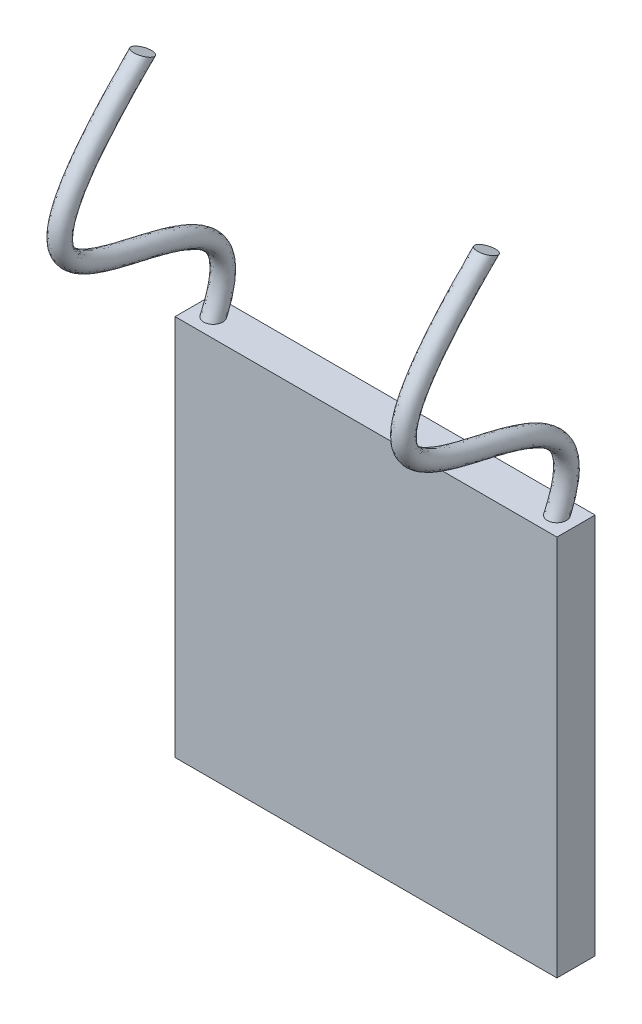
ISO-10303-21;
HEADER;
FILE_DESCRIPTION(('STEP AP214'),'2;1');
FILE_NAME('part.step','',(''),(''),'','','');
FILE_SCHEMA(('AUTOMOTIVE_DESIGN { 1 0 10303 214 1 1 1 1 }'));
ENDSEC;
DATA;
#1=APPLICATION_CONTEXT('core data for automotive mechanical design processes');
#2=APPLICATION_PROTOCOL_DEFINITION('international standard','automotive_design',2000,#1);
#3=PRODUCT_CONTEXT('',#1,'mechanical');
#4=PRODUCT('Part','Part','',(#3));
#5=PRODUCT_RELATED_PRODUCT_CATEGORY('part','',(#4));
#6=PRODUCT_DEFINITION_FORMATION('','',#4);
#7=PRODUCT_DEFINITION_CONTEXT('part definition',#1,'design');
#8=PRODUCT_DEFINITION('design','',#6,#7);
#9=PRODUCT_DEFINITION_SHAPE('','',#8);
#10=(LENGTH_UNIT() NAMED_UNIT(*) SI_UNIT(.MILLI.,.METRE.));
#11=(NAMED_UNIT(*) PLANE_ANGLE_UNIT() SI_UNIT($,.RADIAN.));
#12=(NAMED_UNIT(*) SI_UNIT($,.STERADIAN.) SOLID_ANGLE_UNIT());
#13=UNCERTAINTY_MEASURE_WITH_UNIT(LENGTH_MEASURE(1.E-05),#10,'distance_accuracy_value','');
#14=(GEOMETRIC_REPRESENTATION_CONTEXT(3) GLOBAL_UNCERTAINTY_ASSIGNED_CONTEXT((#13)) GLOBAL_UNIT_ASSIGNED_CONTEXT((#10,
#11,#12)) REPRESENTATION_CONTEXT('',''));
#15=CARTESIAN_POINT('',(0.,0.,0.));
#16=DIRECTION('',(0.,0.,1.));
#17=DIRECTION('',(1.,0.,0.));
#18=AXIS2_PLACEMENT_3D('',#15,#16,#17);
#19=CARTESIAN_POINT('',(-20.,-20.,4.));
#20=DIRECTION('',(1.,0.,0.));
#21=DIRECTION('',(0.,0.,-1.));
#22=AXIS2_PLACEMENT_3D('',#19,#20,#21);
#23=PLANE('',#22);
#24=DIRECTION('',(0.,-1.,0.));
#25=VECTOR('',#24,1.);
#26=CARTESIAN_POINT('',(-20.,-20.,0.));
#27=LINE('',#26,#25);
#28=CARTESIAN_POINT('',(-20.,20.,0.));
#29=VERTEX_POINT('',#28);
#30=CARTESIAN_POINT('',(-20.,-20.,0.));
#31=VERTEX_POINT('',#30);
#32=EDGE_CURVE('E103',#29,#31,#27,.T.);
#33=ORIENTED_EDGE('',*,*,#32,.T.);
#34=DIRECTION('',(0.,0.,-1.));
#35=VECTOR('',#34,1.);
#36=CARTESIAN_POINT('',(-20.,-20.,4.));
#37=LINE('',#36,#35);
#38=CARTESIAN_POINT('',(-20.,-20.,4.));
#39=VERTEX_POINT('',#38);
#40=EDGE_CURVE('E11',#39,#31,#37,.T.);
#41=ORIENTED_EDGE('',*,*,#40,.F.);
#42=DIRECTION('',(0.,-1.,0.));
#43=VECTOR('',#42,1.);
#44=CARTESIAN_POINT('',(-20.,-20.,4.));
#45=LINE('',#44,#43);
#46=CARTESIAN_POINT('',(-20.,20.,4.));
#47=VERTEX_POINT('',#46);
#48=EDGE_CURVE('E104',#47,#39,#45,.T.);
#49=ORIENTED_EDGE('',*,*,#48,.F.);
#50=DIRECTION('',(0.,0.,-1.));
#51=VECTOR('',#50,1.);
#52=CARTESIAN_POINT('',(-20.,20.,4.));
#53=LINE('',#52,#51);
#54=EDGE_CURVE('E110',#47,#29,#53,.T.);
#55=ORIENTED_EDGE('',*,*,#54,.T.);
#56=EDGE_LOOP('',(#33,#41,#49,#55));
#57=FACE_BOUND('',#56,.T.);
#58=ADVANCED_FACE('F35',(#57),#23,.F.);
#59=CARTESIAN_POINT('',(20.,-20.,4.));
#60=DIRECTION('',(0.,1.,0.));
#61=DIRECTION('',(-1.,0.,0.));
#62=AXIS2_PLACEMENT_3D('',#59,#60,#61);
#63=PLANE('',#62);
#64=DIRECTION('',(1.,0.,0.));
#65=VECTOR('',#64,1.);
#66=CARTESIAN_POINT('',(20.,-20.,0.));
#67=LINE('',#66,#65);
#68=CARTESIAN_POINT('',(20.,-20.,0.));
#69=VERTEX_POINT('',#68);
#70=EDGE_CURVE('E113',#31,#69,#67,.T.);
#71=ORIENTED_EDGE('',*,*,#70,.T.);
#72=DIRECTION('',(0.,0.,-1.));
#73=VECTOR('',#72,1.);
#74=CARTESIAN_POINT('',(20.,-20.,4.));
#75=LINE('',#74,#73);
#76=CARTESIAN_POINT('',(20.,-20.,4.));
#77=VERTEX_POINT('',#76);
#78=EDGE_CURVE('E43',#77,#69,#75,.T.);
#79=ORIENTED_EDGE('',*,*,#78,.F.);
#80=DIRECTION('',(1.,0.,0.));
#81=VECTOR('',#80,1.);
#82=CARTESIAN_POINT('',(20.,-20.,4.));
#83=LINE('',#82,#81);
#84=EDGE_CURVE('E82',#39,#77,#83,.T.);
#85=ORIENTED_EDGE('',*,*,#84,.F.);
#86=ORIENTED_EDGE('',*,*,#40,.T.);
#87=EDGE_LOOP('',(#71,#79,#85,#86));
#88=FACE_BOUND('',#87,.T.);
#89=ADVANCED_FACE('F137',(#88),#63,.F.);
#90=CARTESIAN_POINT('',(20.,-20.,4.));
#91=DIRECTION('',(-1.,0.,0.));
#92=DIRECTION('',(0.,0.,1.));
#93=AXIS2_PLACEMENT_3D('',#90,#91,#92);
#94=PLANE('',#93);
#95=DIRECTION('',(0.,1.,0.));
#96=VECTOR('',#95,1.);
#97=CARTESIAN_POINT('',(20.,-20.,0.));
#98=LINE('',#97,#96);
#99=CARTESIAN_POINT('',(20.,20.,0.));
#100=VERTEX_POINT('',#99);
#101=EDGE_CURVE('E69',#69,#100,#98,.T.);
#102=ORIENTED_EDGE('',*,*,#101,.T.);
#103=DIRECTION('',(0.,0.,-1.));
#104=VECTOR('',#103,1.);
#105=CARTESIAN_POINT('',(20.,20.,4.));
#106=LINE('',#105,#104);
#107=CARTESIAN_POINT('',(20.,20.,4.));
#108=VERTEX_POINT('',#107);
#109=EDGE_CURVE('E118',#108,#100,#106,.T.);
#110=ORIENTED_EDGE('',*,*,#109,.F.);
#111=DIRECTION('',(0.,1.,0.));
#112=VECTOR('',#111,1.);
#113=CARTESIAN_POINT('',(20.,-20.,4.));
#114=LINE('',#113,#112);
#115=EDGE_CURVE('E107',#77,#108,#114,.T.);
#116=ORIENTED_EDGE('',*,*,#115,.F.);
#117=ORIENTED_EDGE('',*,*,#78,.T.);
#118=EDGE_LOOP('',(#102,#110,#116,#117));
#119=FACE_BOUND('',#118,.T.);
#120=ADVANCED_FACE('F120',(#119),#94,.F.);
#121=CARTESIAN_POINT('',(20.,20.,4.));
#122=DIRECTION('',(0.,-1.,0.));
#123=DIRECTION('',(1.,0.,0.));
#124=AXIS2_PLACEMENT_3D('',#121,#122,#123);
#125=PLANE('',#124);
#126=CARTESIAN_POINT('',(18.,20.,2.));
#127=DIRECTION('',(0.,1.,0.));
#128=DIRECTION('',(-1.,0.,0.));
#129=AXIS2_PLACEMENT_3D('',#126,#127,#128);
#130=CIRCLE('',#129,1.);
#131=CARTESIAN_POINT('',(17.,20.,2.));
#132=VERTEX_POINT('',#131);
#133=EDGE_CURVE('E94',#132,#132,#130,.T.);
#134=ORIENTED_EDGE('',*,*,#133,.F.);
#135=EDGE_LOOP('',(#134));
#136=FACE_BOUND('',#135,.T.);
#137=CARTESIAN_POINT('',(-18.,20.,2.));
#138=DIRECTION('',(0.,1.,0.));
#139=DIRECTION('',(-1.,0.,0.));
#140=AXIS2_PLACEMENT_3D('',#137,#138,#139);
#141=CIRCLE('',#140,1.);
#142=CARTESIAN_POINT('',(-19.,20.,2.));
#143=VERTEX_POINT('',#142);
#144=EDGE_CURVE('E93',#143,#143,#141,.T.);
#145=ORIENTED_EDGE('',*,*,#144,.F.);
#146=EDGE_LOOP('',(#145));
#147=FACE_BOUND('',#146,.T.);
#148=DIRECTION('',(-1.,0.,0.));
#149=VECTOR('',#148,1.);
#150=CARTESIAN_POINT('',(20.,20.,0.));
#151=LINE('',#150,#149);
#152=EDGE_CURVE('E75',#100,#29,#151,.T.);
#153=ORIENTED_EDGE('',*,*,#152,.T.);
#154=ORIENTED_EDGE('',*,*,#54,.F.);
#155=DIRECTION('',(-1.,0.,0.));
#156=VECTOR('',#155,1.);
#157=CARTESIAN_POINT('',(20.,20.,4.));
#158=LINE('',#157,#156);
#159=EDGE_CURVE('E51',#108,#47,#158,.T.);
#160=ORIENTED_EDGE('',*,*,#159,.F.);
#161=ORIENTED_EDGE('',*,*,#109,.T.);
#162=EDGE_LOOP('',(#153,#154,#160,#161));
#163=FACE_BOUND('',#162,.T.);
#164=ADVANCED_FACE('F127',(#136,#147,#163),#125,.F.);
#165=CARTESIAN_POINT('',(0.,0.,4.));
#166=DIRECTION('',(0.,0.,1.));
#167=DIRECTION('',(1.,0.,0.));
#168=AXIS2_PLACEMENT_3D('',#165,#166,#167);
#169=PLANE('',#168);
#170=ORIENTED_EDGE('',*,*,#48,.T.);
#171=ORIENTED_EDGE('',*,*,#84,.T.);
#172=ORIENTED_EDGE('',*,*,#115,.T.);
#173=ORIENTED_EDGE('',*,*,#159,.T.);
#174=EDGE_LOOP('',(#170,#171,#172,#173));
#175=FACE_BOUND('',#174,.T.);
#176=ADVANCED_FACE('F129',(#175),#169,.T.);
#177=CARTESIAN_POINT('',(0.,0.,0.));
#178=DIRECTION('',(0.,0.,1.));
#179=DIRECTION('',(1.,0.,0.));
#180=AXIS2_PLACEMENT_3D('',#177,#178,#179);
#181=PLANE('',#180);
#182=ORIENTED_EDGE('',*,*,#32,.F.);
#183=ORIENTED_EDGE('',*,*,#152,.F.);
#184=ORIENTED_EDGE('',*,*,#101,.F.);
#185=ORIENTED_EDGE('',*,*,#70,.F.);
#186=EDGE_LOOP('',(#182,#183,#184,#185));
#187=FACE_BOUND('',#186,.T.);
#188=ADVANCED_FACE('F123',(#187),#181,.F.);
#189=CARTESIAN_POINT('',(-18.,47.7315491474002,9.39265668040434));
#190=DIRECTION('',(0.,0.933485479720393,-0.358615196486689));
#191=DIRECTION('',(-1.,0.,0.));
#192=AXIS2_PLACEMENT_3D('',#189,#190,#191);
#193=PLANE('',#192);
#194=CARTESIAN_POINT('',(-18.,47.7315491474002,9.39265668040434));
#195=DIRECTION('',(0.,0.933485479720393,-0.358615196486689));
#196=DIRECTION('',(-1.,0.,0.));
#197=AXIS2_PLACEMENT_3D('',#194,#195,#196);
#198=CIRCLE('',#197,1.);
#199=CARTESIAN_POINT('',(-19.,47.7315491474002,9.39265668040434));
#200=VERTEX_POINT('',#199);
#201=EDGE_CURVE('E97',#200,#200,#198,.T.);
#202=ORIENTED_EDGE('',*,*,#201,.T.);
#203=EDGE_LOOP('',(#202));
#204=FACE_BOUND('',#203,.T.);
#205=ADVANCED_FACE('F167',(#204),#193,.T.);
#206=CARTESIAN_POINT('',(-19.,20.,2.));
#207=CARTESIAN_POINT('',(-19.,21.0670997371017,1.51586374142114));
#208=CARTESIAN_POINT('',(-19.,22.0095176377463,1.22220942508424));
#209=CARTESIAN_POINT('',(-19.,23.6802761002597,0.959390587549751));
#210=CARTESIAN_POINT('',(-19.0000000000023,24.4086166579434,0.990226073083721));
#211=CARTESIAN_POINT('',(-18.9999999999977,25.6865067750286,1.31991273986891));
#212=CARTESIAN_POINT('',(-19.,26.2360563258722,1.61876393486796));
#213=CARTESIAN_POINT('',(-19.,27.1916507655463,2.42800792793888));
#214=CARTESIAN_POINT('',(-19.,27.5976956448252,2.9384007413274));
#215=CARTESIAN_POINT('',(-19.,28.6535027901487,4.70218045341647));
#216=CARTESIAN_POINT('',(-19.,29.1409375383051,6.18816866464113));
#217=CARTESIAN_POINT('',(-19.,29.9652243745418,9.32862246345075));
#218=CARTESIAN_POINT('',(-19.,30.3020764497263,10.983088071588));
#219=CARTESIAN_POINT('',(-19.,31.1074886143521,14.0087039483049));
#220=CARTESIAN_POINT('',(-19.,31.5760486896958,15.379854239414));
#221=CARTESIAN_POINT('',(-19.,32.589387824446,16.8852486259864));
#222=CARTESIAN_POINT('',(-19.,32.9789173648791,17.2951582594693));
#223=CARTESIAN_POINT('',(-19.,33.8967624618766,17.8747264075598));
#224=CARTESIAN_POINT('',(-19.,34.4250780060611,18.0443849419762));
#225=CARTESIAN_POINT('',(-19.,35.6557814438905,18.0869768040178));
#226=CARTESIAN_POINT('',(-18.9999999999985,36.3581693275219,17.9599101476336));
#227=CARTESIAN_POINT('',(-19.0000000000015,37.9723037743115,17.35257754537));
#228=CARTESIAN_POINT('',(-19.0000000000021,38.884050331782,16.8723116085556));
#229=CARTESIAN_POINT('',(-18.9999999999957,41.9862575198189,14.8170037377517));
#230=CARTESIAN_POINT('',(-19.,44.5436856578963,12.6274517563375));
#231=CARTESIAN_POINT('',(-19.,47.7315491474002,9.39265668040434));
#232=CARTESIAN_POINT('',(-19.,20.,4.));
#233=CARTESIAN_POINT('',(-19.,20.9283370369136,3.51586374260125));
#234=CARTESIAN_POINT('',(-19.,21.6945365592223,3.21019307751219));
#235=CARTESIAN_POINT('',(-19.,22.9287373989578,2.82660285222384));
#236=CARTESIAN_POINT('',(-19.0000000000023,23.3927758472019,2.74022926184158));
#237=CARTESIAN_POINT('',(-18.9999999999977,24.1921289199463,2.68419955844024));
#238=CARTESIAN_POINT('',(-19.,24.5442601946982,2.71925065370044));
#239=CARTESIAN_POINT('',(-19.,25.2682200596576,3.03928489506944));
#240=CARTESIAN_POINT('',(-19.,25.6295607961054,3.33160810968787));
#241=CARTESIAN_POINT('',(-19.,26.6283586156752,4.59513649010258));
#242=CARTESIAN_POINT('',(-19.,27.1564779628916,5.9275783373604));
#243=CARTESIAN_POINT('',(-19.,28.0068299642699,8.91548996377307));
#244=CARTESIAN_POINT('',(-19.,28.3435527999129,10.5690223824174));
#245=CARTESIAN_POINT('',(-19.,29.1208371103265,13.7627749363371));
#246=CARTESIAN_POINT('',(-19.,29.5348478776269,15.3017003911743));
#247=CARTESIAN_POINT('',(-19.,30.6514997930974,17.4216646355104));
#248=CARTESIAN_POINT('',(-19.,31.1207158195899,18.1094377853342));
#249=CARTESIAN_POINT('',(-19.,32.4127459371517,19.2580770536007));
#250=CARTESIAN_POINT('',(-19.,33.2427835204446,19.6904420220105));
#251=CARTESIAN_POINT('',(-19.,35.0604372756888,20.024214411342));
#252=CARTESIAN_POINT('',(-18.9999999999985,36.0280301116144,19.9424437799874));
#253=CARTESIAN_POINT('',(-19.0000000000015,38.0384460537261,19.3613226075603));
#254=CARTESIAN_POINT('',(-19.0000000000021,39.0916060563703,18.8646032160699));
#255=CARTESIAN_POINT('',(-18.9999999999957,42.522391115969,16.7565350442141));
#256=CARTESIAN_POINT('',(-19.,45.1829074666191,14.5243911131859));
#257=CARTESIAN_POINT('',(-19.,48.4487795403736,11.2596276398451));
#258=CARTESIAN_POINT('',(-17.,20.,4.));
#259=CARTESIAN_POINT('',(-17.,20.9283370369136,3.51586374260125));
#260=CARTESIAN_POINT('',(-17.,21.6945365592223,3.21019307751219));
#261=CARTESIAN_POINT('',(-17.,22.9287373989578,2.82660285222384));
#262=CARTESIAN_POINT('',(-17.0000000000023,23.3927758472019,2.74022926184158));
#263=CARTESIAN_POINT('',(-16.9999999999977,24.1921289199463,2.68419955844024));
#264=CARTESIAN_POINT('',(-17.,24.5442601946982,2.71925065370044));
#265=CARTESIAN_POINT('',(-17.,25.2682200596576,3.03928489506944));
#266=CARTESIAN_POINT('',(-17.,25.6295607961054,3.33160810968787));
#267=CARTESIAN_POINT('',(-17.,26.6283586156752,4.59513649010258));
#268=CARTESIAN_POINT('',(-17.,27.1564779628916,5.9275783373604));
#269=CARTESIAN_POINT('',(-17.,28.0068299642699,8.91548996377307));
#270=CARTESIAN_POINT('',(-17.,28.3435527999129,10.5690223824174));
#271=CARTESIAN_POINT('',(-17.,29.1208371103265,13.7627749363371));
#272=CARTESIAN_POINT('',(-17.,29.5348478776269,15.3017003911743));
#273=CARTESIAN_POINT('',(-17.,30.6514997930974,17.4216646355104));
#274=CARTESIAN_POINT('',(-17.,31.1207158195899,18.1094377853342));
#275=CARTESIAN_POINT('',(-17.,32.4127459371517,19.2580770536007));
#276=CARTESIAN_POINT('',(-17.,33.2427835204446,19.6904420220105));
#277=CARTESIAN_POINT('',(-17.,35.0604372756888,20.024214411342));
#278=CARTESIAN_POINT('',(-16.9999999999985,36.0280301116144,19.9424437799874));
#279=CARTESIAN_POINT('',(-17.0000000000015,38.0384460537261,19.3613226075603));
#280=CARTESIAN_POINT('',(-17.0000000000021,39.0916060563703,18.8646032160699));
#281=CARTESIAN_POINT('',(-16.9999999999957,42.522391115969,16.7565350442141));
#282=CARTESIAN_POINT('',(-17.,45.1829074666191,14.5243911131859));
#283=CARTESIAN_POINT('',(-17.,48.4487795403736,11.2596276398451));
#284=CARTESIAN_POINT('',(-17.,20.,2.));
#285=CARTESIAN_POINT('',(-17.,21.0670997371017,1.51586374142114));
#286=CARTESIAN_POINT('',(-17.,22.0095176377463,1.22220942508424));
#287=CARTESIAN_POINT('',(-17.,23.6802761002597,0.959390587549751));
#288=CARTESIAN_POINT('',(-17.0000000000023,24.4086166579434,0.990226073083721));
#289=CARTESIAN_POINT('',(-16.9999999999977,25.6865067750286,1.31991273986891));
#290=CARTESIAN_POINT('',(-17.,26.2360563258722,1.61876393486796));
#291=CARTESIAN_POINT('',(-17.,27.1916507655463,2.42800792793888));
#292=CARTESIAN_POINT('',(-17.,27.5976956448252,2.9384007413274));
#293=CARTESIAN_POINT('',(-17.,28.6535027901487,4.70218045341647));
#294=CARTESIAN_POINT('',(-17.,29.1409375383051,6.18816866464113));
#295=CARTESIAN_POINT('',(-17.,29.9652243745418,9.32862246345075));
#296=CARTESIAN_POINT('',(-17.,30.3020764497263,10.983088071588));
#297=CARTESIAN_POINT('',(-17.,31.1074886143521,14.0087039483049));
#298=CARTESIAN_POINT('',(-17.,31.5760486896958,15.379854239414));
#299=CARTESIAN_POINT('',(-17.,32.589387824446,16.8852486259864));
#300=CARTESIAN_POINT('',(-17.,32.9789173648791,17.2951582594693));
#301=CARTESIAN_POINT('',(-17.,33.8967624618766,17.8747264075598));
#302=CARTESIAN_POINT('',(-17.,34.4250780060611,18.0443849419762));
#303=CARTESIAN_POINT('',(-17.,35.6557814438905,18.0869768040178));
#304=CARTESIAN_POINT('',(-16.9999999999985,36.3581693275219,17.9599101476336));
#305=CARTESIAN_POINT('',(-17.0000000000015,37.9723037743115,17.35257754537));
#306=CARTESIAN_POINT('',(-17.0000000000021,38.884050331782,16.8723116085556));
#307=CARTESIAN_POINT('',(-16.9999999999957,41.9862575198189,14.8170037377517));
#308=CARTESIAN_POINT('',(-17.,44.5436856578963,12.6274517563375));
#309=CARTESIAN_POINT('',(-17.,47.7315491474002,9.39265668040434));
#310=CARTESIAN_POINT('',(-17.,20.,0.));
#311=CARTESIAN_POINT('',(-17.,21.2058624372897,-0.484136259758961));
#312=CARTESIAN_POINT('',(-17.,22.3244987162703,-0.765774227343708));
#313=CARTESIAN_POINT('',(-17.,24.4318148015616,-0.907821677124339));
#314=CARTESIAN_POINT('',(-17.0000000000023,25.4244574686849,-0.759777115674136));
#315=CARTESIAN_POINT('',(-16.9999999999977,27.1808846301108,-0.0443740787024094));
#316=CARTESIAN_POINT('',(-17.,27.9278524570462,0.518277216035486));
#317=CARTESIAN_POINT('',(-17.,29.1150814714349,1.81673096080833));
#318=CARTESIAN_POINT('',(-17.,29.5658304935451,2.54519337296693));
#319=CARTESIAN_POINT('',(-17.,30.6786469646223,4.80922441673037));
#320=CARTESIAN_POINT('',(-17.,31.1253971137185,6.44875899192187));
#321=CARTESIAN_POINT('',(-17.,31.9236187848137,9.74175496312843));
#322=CARTESIAN_POINT('',(-17.,32.2606000995397,11.3971537607586));
#323=CARTESIAN_POINT('',(-17.,33.0941401183778,14.2546329602727));
#324=CARTESIAN_POINT('',(-17.,33.6172495017648,15.4580080876536));
#325=CARTESIAN_POINT('',(-17.,34.5272758557946,16.3488326164625));
#326=CARTESIAN_POINT('',(-17.,34.8371189101684,16.4808787336045));
#327=CARTESIAN_POINT('',(-17.,35.3807789866015,16.4913757615189));
#328=CARTESIAN_POINT('',(-17.,35.6073724916777,16.3983278619419));
#329=CARTESIAN_POINT('',(-17.,36.2511256120921,16.1497391966936));
#330=CARTESIAN_POINT('',(-16.9999999999985,36.6883085434295,15.9773765152798));
#331=CARTESIAN_POINT('',(-17.0000000000015,37.9061614948969,15.3438324831796));
#332=CARTESIAN_POINT('',(-17.0000000000021,38.6764946071936,14.8800200010413));
#333=CARTESIAN_POINT('',(-16.9999999999957,41.4501239236687,12.8774724312892));
#334=CARTESIAN_POINT('',(-17.,43.9044638491734,10.7305123994892));
#335=CARTESIAN_POINT('',(-17.,47.0143187544268,7.52568572096355));
#336=CARTESIAN_POINT('',(-19.,20.,0.));
#337=CARTESIAN_POINT('',(-19.,21.2058624372897,-0.484136259758961));
#338=CARTESIAN_POINT('',(-19.,22.3244987162703,-0.765774227343708));
#339=CARTESIAN_POINT('',(-19.,24.4318148015616,-0.907821677124339));
#340=CARTESIAN_POINT('',(-19.0000000000023,25.4244574686849,-0.759777115674136));
#341=CARTESIAN_POINT('',(-18.9999999999977,27.1808846301108,-0.0443740787024093));
#342=CARTESIAN_POINT('',(-19.,27.9278524570462,0.518277216035486));
#343=CARTESIAN_POINT('',(-19.,29.1150814714349,1.81673096080833));
#344=CARTESIAN_POINT('',(-19.,29.5658304935451,2.54519337296693));
#345=CARTESIAN_POINT('',(-19.,30.6786469646223,4.80922441673037));
#346=CARTESIAN_POINT('',(-19.,31.1253971137185,6.44875899192187));
#347=CARTESIAN_POINT('',(-19.,31.9236187848137,9.74175496312843));
#348=CARTESIAN_POINT('',(-19.,32.2606000995397,11.3971537607586));
#349=CARTESIAN_POINT('',(-19.,33.0941401183778,14.2546329602727));
#350=CARTESIAN_POINT('',(-19.,33.6172495017648,15.4580080876536));
#351=CARTESIAN_POINT('',(-19.,34.5272758557946,16.3488326164625));
#352=CARTESIAN_POINT('',(-19.,34.8371189101684,16.4808787336045));
#353=CARTESIAN_POINT('',(-19.,35.3807789866015,16.4913757615189));
#354=CARTESIAN_POINT('',(-19.,35.6073724916777,16.3983278619419));
#355=CARTESIAN_POINT('',(-19.,36.2511256120921,16.1497391966936));
#356=CARTESIAN_POINT('',(-18.9999999999985,36.6883085434295,15.9773765152798));
#357=CARTESIAN_POINT('',(-19.0000000000015,37.9061614948969,15.3438324831796));
#358=CARTESIAN_POINT('',(-19.0000000000021,38.6764946071936,14.8800200010413));
#359=CARTESIAN_POINT('',(-18.9999999999957,41.4501239236687,12.8774724312892));
#360=CARTESIAN_POINT('',(-19.,43.9044638491734,10.7305123994892));
#361=CARTESIAN_POINT('',(-19.,47.0143187544268,7.52568572096355));
#362=CARTESIAN_POINT('',(-19.,20.,2.));
#363=CARTESIAN_POINT('',(-19.,21.0670997371017,1.51586374142114));
#364=CARTESIAN_POINT('',(-19.,22.0095176377463,1.22220942508424));
#365=CARTESIAN_POINT('',(-19.,23.6802761002597,0.959390587549751));
#366=CARTESIAN_POINT('',(-19.0000000000023,24.4086166579434,0.990226073083721));
#367=CARTESIAN_POINT('',(-18.9999999999977,25.6865067750286,1.31991273986891));
#368=CARTESIAN_POINT('',(-19.,26.2360563258722,1.61876393486796));
#369=CARTESIAN_POINT('',(-19.,27.1916507655463,2.42800792793888));
#370=CARTESIAN_POINT('',(-19.,27.5976956448252,2.9384007413274));
#371=CARTESIAN_POINT('',(-19.,28.6535027901487,4.70218045341647));
#372=CARTESIAN_POINT('',(-19.,29.1409375383051,6.18816866464113));
#373=CARTESIAN_POINT('',(-19.,29.9652243745418,9.32862246345075));
#374=CARTESIAN_POINT('',(-19.,30.3020764497263,10.983088071588));
#375=CARTESIAN_POINT('',(-19.,31.1074886143521,14.0087039483049));
#376=CARTESIAN_POINT('',(-19.,31.5760486896958,15.379854239414));
#377=CARTESIAN_POINT('',(-19.,32.589387824446,16.8852486259864));
#378=CARTESIAN_POINT('',(-19.,32.9789173648791,17.2951582594693));
#379=CARTESIAN_POINT('',(-19.,33.8967624618766,17.8747264075598));
#380=CARTESIAN_POINT('',(-19.,34.4250780060611,18.0443849419762));
#381=CARTESIAN_POINT('',(-19.,35.6557814438905,18.0869768040178));
#382=CARTESIAN_POINT('',(-18.9999999999985,36.3581693275219,17.9599101476336));
#383=CARTESIAN_POINT('',(-19.0000000000015,37.9723037743115,17.35257754537));
#384=CARTESIAN_POINT('',(-19.0000000000021,38.884050331782,16.8723116085556));
#385=CARTESIAN_POINT('',(-18.9999999999957,41.9862575198189,14.8170037377517));
#386=CARTESIAN_POINT('',(-19.,44.5436856578963,12.6274517563375));
#387=CARTESIAN_POINT('',(-19.,47.7315491474002,9.39265668040434));
#388=(BOUNDED_SURFACE() B_SPLINE_SURFACE(3,3,((#206,#207,#208,#209,#210,#211,#212,#213,#214,
#215,#216,#217,#218,#219,#220,#221,#222,#223,#224,#225,#226,#227,#228,#229,#230,#231),(#232,
#233,#234,#235,#236,#237,#238,#239,#240,#241,#242,#243,#244,#245,#246,#247,#248,#249,#250,#251,
#252,#253,#254,#255,#256,#257),(#258,#259,#260,#261,#262,#263,#264,#265,#266,#267,#268,#269,
#270,#271,#272,#273,#274,#275,#276,#277,#278,#279,#280,#281,#282,#283),(#284,#285,#286,#287,
#288,#289,#290,#291,#292,#293,#294,#295,#296,#297,#298,#299,#300,#301,#302,#303,#304,#305,#306,
#307,#308,#309),(#310,#311,#312,#313,#314,#315,#316,#317,#318,#319,#320,#321,#322,#323,#324,
#325,#326,#327,#328,#329,#330,#331,#332,#333,#334,#335),(#336,#337,#338,#339,#340,#341,#342,
#343,#344,#345,#346,#347,#348,#349,#350,#351,#352,#353,#354,#355,#356,#357,#358,#359,#360,#361),
(#362,#363,#364,#365,#366,#367,#368,#369,#370,#371,#372,#373,#374,#375,#376,#377,#378,#379,#380,
#381,#382,#383,#384,#385,#386,#387)),.UNSPECIFIED.,.T.,.F.,.F.) B_SPLINE_SURFACE_WITH_KNOTS((4,
3,4),(4,2,2,2,2,2,2,2,2,2,2,2,4),(0.,0.5,1.),(0.,0.0625,0.125,0.1875,0.25,0.375,0.5,0.625,
0.6875,0.75,0.8125,0.875,1.),
.UNSPECIFIED.) GEOMETRIC_REPRESENTATION_ITEM() RATIONAL_B_SPLINE_SURFACE(((1.,1.,1.,1.,1.,1.,1.,
1.,1.,1.,1.,1.,1.,1.,1.,1.,1.,1.,1.,1.,1.,1.,1.,1.,1.,1.),(0.333333333333333,0.333333333333333,
0.333333333333333,0.333333333333333,0.333333333333333,0.333333333333333,0.333333333333333,
0.333333333333333,0.333333333333333,0.333333333333333,0.333333333333333,0.333333333333333,
0.333333333333333,0.333333333333333,0.333333333333333,0.333333333333333,0.333333333333333,
0.333333333333333,0.333333333333333,0.333333333333333,0.333333333333333,0.333333333333333,
0.333333333333333,0.333333333333333,0.333333333333333,0.333333333333333),(0.333333333333333,
0.333333333333333,0.333333333333333,0.333333333333333,0.333333333333333,0.333333333333333,
0.333333333333333,0.333333333333333,0.333333333333333,0.333333333333333,0.333333333333333,
0.333333333333333,0.333333333333333,0.333333333333333,0.333333333333333,0.333333333333333,
0.333333333333333,0.333333333333333,0.333333333333333,0.333333333333333,0.333333333333333,
0.333333333333333,0.333333333333333,0.333333333333333,0.333333333333333,0.333333333333333),(1.,
1.,1.,1.,1.,1.,1.,1.,1.,1.,1.,1.,1.,1.,1.,1.,1.,1.,1.,1.,1.,1.,1.,1.,1.,1.),(0.333333333333333,
0.333333333333333,0.333333333333333,0.333333333333333,0.333333333333333,0.333333333333333,
0.333333333333333,0.333333333333333,0.333333333333333,0.333333333333333,0.333333333333333,
0.333333333333333,0.333333333333333,0.333333333333333,0.333333333333333,0.333333333333333,
0.333333333333333,0.333333333333333,0.333333333333333,0.333333333333333,0.333333333333333,
0.333333333333333,0.333333333333333,0.333333333333333,0.333333333333333,0.333333333333333),
(0.333333333333333,0.333333333333333,0.333333333333333,0.333333333333333,0.333333333333333,
0.333333333333333,0.333333333333333,0.333333333333333,0.333333333333333,0.333333333333333,
0.333333333333333,0.333333333333333,0.333333333333333,0.333333333333333,0.333333333333333,
0.333333333333333,0.333333333333333,0.333333333333333,0.333333333333333,0.333333333333333,
0.333333333333333,0.333333333333333,0.333333333333333,0.333333333333333,0.333333333333333,
0.333333333333333),(1.,1.,1.,1.,1.,1.,1.,1.,1.,1.,1.,1.,1.,1.,1.,1.,1.,1.,1.,1.,1.,1.,1.,1.,1.,1.))) REPRESENTATION_ITEM('') SURFACE());
#389=ORIENTED_EDGE('',*,*,#201,.F.);
#390=EDGE_LOOP('',(#389));
#391=FACE_BOUND('',#390,.T.);
#392=ORIENTED_EDGE('',*,*,#144,.T.);
#393=EDGE_LOOP('',(#392));
#394=FACE_BOUND('',#393,.T.);
#395=ADVANCED_FACE('F168',(#391,#394),#388,.T.);
#396=CARTESIAN_POINT('',(18.,47.7315491474002,9.39265668040434));
#397=DIRECTION('',(0.,0.933485479720393,-0.358615196486689));
#398=DIRECTION('',(-1.,0.,0.));
#399=AXIS2_PLACEMENT_3D('',#396,#397,#398);
#400=PLANE('',#399);
#401=CARTESIAN_POINT('',(18.,47.7315491474002,9.39265668040434));
#402=DIRECTION('',(0.,0.933485479720393,-0.358615196486689));
#403=DIRECTION('',(-1.,0.,0.));
#404=AXIS2_PLACEMENT_3D('',#401,#402,#403);
#405=CIRCLE('',#404,1.);
#406=CARTESIAN_POINT('',(17.,47.7315491474002,9.39265668040434));
#407=VERTEX_POINT('',#406);
#408=EDGE_CURVE('E90',#407,#407,#405,.T.);
#409=ORIENTED_EDGE('',*,*,#408,.T.);
#410=EDGE_LOOP('',(#409));
#411=FACE_BOUND('',#410,.T.);
#412=ADVANCED_FACE('F91',(#411),#400,.T.);
#413=CARTESIAN_POINT('',(17.,20.,2.));
#414=CARTESIAN_POINT('',(17.,21.0670997371017,1.51586374142114));
#415=CARTESIAN_POINT('',(17.,22.0095176377463,1.22220942508497));
#416=CARTESIAN_POINT('',(17.,23.6802761002597,0.959390587549019));
#417=CARTESIAN_POINT('',(16.9999999999977,24.4086166579423,0.990226073083153));
#418=CARTESIAN_POINT('',(17.0000000000023,25.6865067750297,1.31991273986949));
#419=CARTESIAN_POINT('',(17.,26.2360563258733,1.61876393486796));
#420=CARTESIAN_POINT('',(17.,27.1916507655452,2.42800792793889));
#421=CARTESIAN_POINT('',(17.,27.5976956448252,2.93840074132741));
#422=CARTESIAN_POINT('',(17.,28.6535027901487,4.70218045341648));
#423=CARTESIAN_POINT('',(17.,29.1409375383023,6.18816866464114));
#424=CARTESIAN_POINT('',(17.,29.9652243745446,9.32862246345076));
#425=CARTESIAN_POINT('',(17.,30.3020764497263,10.983088071588));
#426=CARTESIAN_POINT('',(17.,31.1074886143521,14.0087039483049));
#427=CARTESIAN_POINT('',(17.,31.5760486897,15.379854239414));
#428=CARTESIAN_POINT('',(17.,32.5893878244439,16.8852486259864));
#429=CARTESIAN_POINT('',(17.,32.9789173648791,17.2951582594693));
#430=CARTESIAN_POINT('',(17.,33.8967624618766,17.8747264075598));
#431=CARTESIAN_POINT('',(17.,34.4250780060633,18.0443849419762));
#432=CARTESIAN_POINT('',(17.,35.6557814438883,18.0869768040178));
#433=CARTESIAN_POINT('',(17.0000000000015,36.3581693275219,17.9599101476336));
#434=CARTESIAN_POINT('',(16.9999999999985,37.9723037743115,17.35257754537));
#435=CARTESIAN_POINT('',(16.9999999999978,38.884050331782,16.8723116085556));
#436=CARTESIAN_POINT('',(17.0000000000043,41.9862575198189,14.8170037377517));
#437=CARTESIAN_POINT('',(17.,44.5436856578333,12.6274517563375));
#438=CARTESIAN_POINT('',(17.,47.7315491474002,9.39265668040434));
#439=CARTESIAN_POINT('',(17.,20.,4.));
#440=CARTESIAN_POINT('',(17.,20.9283370369136,3.51586374260125));
#441=CARTESIAN_POINT('',(17.,21.6945365592223,3.21019307751274));
#442=CARTESIAN_POINT('',(17.,22.9287373989578,2.82660285222329));
#443=CARTESIAN_POINT('',(16.9999999999977,23.3927758472002,2.7402292618413));
#444=CARTESIAN_POINT('',(17.0000000000023,24.1921289199481,2.68419955844053));
#445=CARTESIAN_POINT('',(17.,24.5442601946987,2.71925065370044));
#446=CARTESIAN_POINT('',(17.,25.2682200596571,3.03928489506944));
#447=CARTESIAN_POINT('',(17.,25.6295607961048,3.33160810968788));
#448=CARTESIAN_POINT('',(17.,26.6283586156763,4.59513649010259));
#449=CARTESIAN_POINT('',(17.,27.1564779628888,5.92757833736041));
#450=CARTESIAN_POINT('',(17.,28.0068299642727,8.91548996377308));
#451=CARTESIAN_POINT('',(17.,28.3435527999129,10.5690223824174));
#452=CARTESIAN_POINT('',(17.,29.1208371103265,13.7627749363371));
#453=CARTESIAN_POINT('',(17.,29.5348478776311,15.3017003911744));
#454=CARTESIAN_POINT('',(17.,30.6514997930953,17.4216646355104));
#455=CARTESIAN_POINT('',(17.,31.1207158195889,18.1094377853342));
#456=CARTESIAN_POINT('',(17.,32.4127459371526,19.2580770536007));
#457=CARTESIAN_POINT('',(17.,33.2427835204467,19.6904420220105));
#458=CARTESIAN_POINT('',(17.,35.0604372756867,20.024214411342));
#459=CARTESIAN_POINT('',(17.0000000000015,36.0280301116144,19.9424437799874));
#460=CARTESIAN_POINT('',(16.9999999999985,38.0384460537261,19.3613226075603));
#461=CARTESIAN_POINT('',(16.9999999999978,39.0916060563725,18.8646032160688));
#462=CARTESIAN_POINT('',(17.0000000000043,42.5223911159647,16.7565350442163));
#463=CARTESIAN_POINT('',(17.,45.1829074664695,14.5243911131859));
#464=CARTESIAN_POINT('',(17.,48.4487795403736,11.2596276398451));
#465=CARTESIAN_POINT('',(19.,20.,4.));
#466=CARTESIAN_POINT('',(19.,20.9283370369136,3.51586374260125));
#467=CARTESIAN_POINT('',(19.,21.6945365592223,3.21019307751274));
#468=CARTESIAN_POINT('',(19.,22.9287373989578,2.82660285222329));
#469=CARTESIAN_POINT('',(18.9999999999977,23.3927758472002,2.7402292618413));
#470=CARTESIAN_POINT('',(19.0000000000023,24.1921289199481,2.68419955844053));
#471=CARTESIAN_POINT('',(19.,24.5442601946987,2.71925065370044));
#472=CARTESIAN_POINT('',(19.,25.2682200596571,3.03928489506944));
#473=CARTESIAN_POINT('',(19.,25.6295607961048,3.33160810968788));
#474=CARTESIAN_POINT('',(19.,26.6283586156763,4.59513649010259));
#475=CARTESIAN_POINT('',(19.,27.1564779628888,5.92757833736041));
#476=CARTESIAN_POINT('',(19.,28.0068299642727,8.91548996377308));
#477=CARTESIAN_POINT('',(19.,28.3435527999129,10.5690223824174));
#478=CARTESIAN_POINT('',(19.,29.1208371103265,13.7627749363371));
#479=CARTESIAN_POINT('',(19.,29.5348478776311,15.3017003911744));
#480=CARTESIAN_POINT('',(19.,30.6514997930953,17.4216646355104));
#481=CARTESIAN_POINT('',(19.,31.1207158195889,18.1094377853342));
#482=CARTESIAN_POINT('',(19.,32.4127459371526,19.2580770536007));
#483=CARTESIAN_POINT('',(19.,33.2427835204467,19.6904420220105));
#484=CARTESIAN_POINT('',(19.,35.0604372756867,20.024214411342));
#485=CARTESIAN_POINT('',(19.0000000000015,36.0280301116144,19.9424437799874));
#486=CARTESIAN_POINT('',(18.9999999999985,38.0384460537261,19.3613226075603));
#487=CARTESIAN_POINT('',(18.9999999999978,39.0916060563725,18.8646032160688));
#488=CARTESIAN_POINT('',(19.0000000000043,42.5223911159647,16.7565350442163));
#489=CARTESIAN_POINT('',(19.,45.1829074664695,14.5243911131859));
#490=CARTESIAN_POINT('',(19.,48.4487795403736,11.2596276398451));
#491=CARTESIAN_POINT('',(19.,20.,2.));
#492=CARTESIAN_POINT('',(19.,21.0670997371017,1.51586374142114));
#493=CARTESIAN_POINT('',(19.,22.0095176377463,1.22220942508497));
#494=CARTESIAN_POINT('',(19.,23.6802761002597,0.959390587549019));
#495=CARTESIAN_POINT('',(18.9999999999977,24.4086166579423,0.990226073083153));
#496=CARTESIAN_POINT('',(19.0000000000023,25.6865067750297,1.31991273986949));
#497=CARTESIAN_POINT('',(19.,26.2360563258733,1.61876393486796));
#498=CARTESIAN_POINT('',(19.,27.1916507655452,2.42800792793889));
#499=CARTESIAN_POINT('',(19.,27.5976956448252,2.93840074132741));
#500=CARTESIAN_POINT('',(19.,28.6535027901487,4.70218045341648));
#501=CARTESIAN_POINT('',(19.,29.1409375383023,6.18816866464114));
#502=CARTESIAN_POINT('',(19.,29.9652243745446,9.32862246345076));
#503=CARTESIAN_POINT('',(19.,30.3020764497263,10.983088071588));
#504=CARTESIAN_POINT('',(19.,31.1074886143521,14.0087039483049));
#505=CARTESIAN_POINT('',(19.,31.5760486897,15.379854239414));
#506=CARTESIAN_POINT('',(19.,32.5893878244439,16.8852486259864));
#507=CARTESIAN_POINT('',(19.,32.9789173648791,17.2951582594693));
#508=CARTESIAN_POINT('',(19.,33.8967624618766,17.8747264075598));
#509=CARTESIAN_POINT('',(19.,34.4250780060633,18.0443849419762));
#510=CARTESIAN_POINT('',(19.,35.6557814438883,18.0869768040178));
#511=CARTESIAN_POINT('',(19.0000000000015,36.3581693275219,17.9599101476336));
#512=CARTESIAN_POINT('',(18.9999999999985,37.9723037743115,17.35257754537));
#513=CARTESIAN_POINT('',(18.9999999999978,38.884050331782,16.8723116085556));
#514=CARTESIAN_POINT('',(19.0000000000043,41.9862575198189,14.8170037377517));
#515=CARTESIAN_POINT('',(19.,44.5436856578333,12.6274517563375));
#516=CARTESIAN_POINT('',(19.,47.7315491474002,9.39265668040434));
#517=CARTESIAN_POINT('',(19.,20.,0.));
#518=CARTESIAN_POINT('',(19.,21.2058624372897,-0.48413625975896));
#519=CARTESIAN_POINT('',(19.,22.3244987162703,-0.765774227342789));
#520=CARTESIAN_POINT('',(19.,24.4318148015616,-0.907821677125255));
#521=CARTESIAN_POINT('',(18.9999999999977,25.4244574686843,-0.75977711567499));
#522=CARTESIAN_POINT('',(19.0000000000023,27.1808846301114,-0.0443740787015456));
#523=CARTESIAN_POINT('',(19.,27.9278524570479,0.51827721603549));
#524=CARTESIAN_POINT('',(19.,29.1150814714333,1.81673096080833));
#525=CARTESIAN_POINT('',(19.,29.5658304935457,2.54519337296694));
#526=CARTESIAN_POINT('',(19.,30.6786469646211,4.80922441673037));
#527=CARTESIAN_POINT('',(19.,31.1253971137157,6.44875899192187));
#528=CARTESIAN_POINT('',(19.,31.9236187848165,9.74175496312844));
#529=CARTESIAN_POINT('',(19.,32.2606000995397,11.3971537607586));
#530=CARTESIAN_POINT('',(19.,33.0941401183778,14.2546329602727));
#531=CARTESIAN_POINT('',(19.,33.617249501769,15.4580080876536));
#532=CARTESIAN_POINT('',(19.,34.5272758557925,16.3488326164625));
#533=CARTESIAN_POINT('',(19.,34.8371189101693,16.4808787336045));
#534=CARTESIAN_POINT('',(19.,35.3807789866006,16.4913757615189));
#535=CARTESIAN_POINT('',(19.,35.6073724916798,16.3983278619419));
#536=CARTESIAN_POINT('',(19.,36.25112561209,16.1497391966936));
#537=CARTESIAN_POINT('',(19.0000000000015,36.6883085434295,15.9773765152798));
#538=CARTESIAN_POINT('',(18.9999999999985,37.9061614948969,15.3438324831796));
#539=CARTESIAN_POINT('',(18.9999999999978,38.6764946071915,14.8800200010424));
#540=CARTESIAN_POINT('',(19.0000000000043,41.4501239236731,12.877472431287));
#541=CARTESIAN_POINT('',(19.,43.9044638491971,10.7305123994892));
#542=CARTESIAN_POINT('',(19.,47.0143187544268,7.52568572096355));
#543=CARTESIAN_POINT('',(17.,20.,0.));
#544=CARTESIAN_POINT('',(17.,21.2058624372897,-0.48413625975896));
#545=CARTESIAN_POINT('',(17.,22.3244987162703,-0.765774227342789));
#546=CARTESIAN_POINT('',(17.,24.4318148015616,-0.907821677125255));
#547=CARTESIAN_POINT('',(16.9999999999977,25.4244574686843,-0.75977711567499));
#548=CARTESIAN_POINT('',(17.0000000000023,27.1808846301114,-0.0443740787015456));
#549=CARTESIAN_POINT('',(17.,27.9278524570479,0.51827721603549));
#550=CARTESIAN_POINT('',(17.,29.1150814714333,1.81673096080833));
#551=CARTESIAN_POINT('',(17.,29.5658304935457,2.54519337296694));
#552=CARTESIAN_POINT('',(17.,30.6786469646211,4.80922441673037));
#553=CARTESIAN_POINT('',(17.,31.1253971137157,6.44875899192187));
#554=CARTESIAN_POINT('',(17.,31.9236187848165,9.74175496312844));
#555=CARTESIAN_POINT('',(17.,32.2606000995397,11.3971537607586));
#556=CARTESIAN_POINT('',(17.,33.0941401183778,14.2546329602727));
#557=CARTESIAN_POINT('',(17.,33.617249501769,15.4580080876536));
#558=CARTESIAN_POINT('',(17.,34.5272758557925,16.3488326164625));
#559=CARTESIAN_POINT('',(17.,34.8371189101693,16.4808787336045));
#560=CARTESIAN_POINT('',(17.,35.3807789866006,16.4913757615189));
#561=CARTESIAN_POINT('',(17.,35.6073724916798,16.3983278619419));
#562=CARTESIAN_POINT('',(17.,36.25112561209,16.1497391966936));
#563=CARTESIAN_POINT('',(17.0000000000015,36.6883085434295,15.9773765152798));
#564=CARTESIAN_POINT('',(16.9999999999985,37.9061614948969,15.3438324831796));
#565=CARTESIAN_POINT('',(16.9999999999978,38.6764946071915,14.8800200010424));
#566=CARTESIAN_POINT('',(17.0000000000043,41.4501239236731,12.877472431287));
#567=CARTESIAN_POINT('',(17.,43.9044638491971,10.7305123994892));
#568=CARTESIAN_POINT('',(17.,47.0143187544268,7.52568572096355));
#569=CARTESIAN_POINT('',(17.,20.,2.));
#570=CARTESIAN_POINT('',(17.,21.0670997371017,1.51586374142114));
#571=CARTESIAN_POINT('',(17.,22.0095176377463,1.22220942508497));
#572=CARTESIAN_POINT('',(17.,23.6802761002597,0.959390587549019));
#573=CARTESIAN_POINT('',(16.9999999999977,24.4086166579423,0.990226073083153));
#574=CARTESIAN_POINT('',(17.0000000000023,25.6865067750297,1.31991273986949));
#575=CARTESIAN_POINT('',(17.,26.2360563258733,1.61876393486796));
#576=CARTESIAN_POINT('',(17.,27.1916507655452,2.42800792793889));
#577=CARTESIAN_POINT('',(17.,27.5976956448252,2.93840074132741));
#578=CARTESIAN_POINT('',(17.,28.6535027901487,4.70218045341648));
#579=CARTESIAN_POINT('',(17.,29.1409375383023,6.18816866464114));
#580=CARTESIAN_POINT('',(17.,29.9652243745446,9.32862246345076));
#581=CARTESIAN_POINT('',(17.,30.3020764497263,10.983088071588));
#582=CARTESIAN_POINT('',(17.,31.1074886143521,14.0087039483049));
#583=CARTESIAN_POINT('',(17.,31.5760486897,15.379854239414));
#584=CARTESIAN_POINT('',(17.,32.5893878244439,16.8852486259864));
#585=CARTESIAN_POINT('',(17.,32.9789173648791,17.2951582594693));
#586=CARTESIAN_POINT('',(17.,33.8967624618766,17.8747264075598));
#587=CARTESIAN_POINT('',(17.,34.4250780060633,18.0443849419762));
#588=CARTESIAN_POINT('',(17.,35.6557814438883,18.0869768040178));
#589=CARTESIAN_POINT('',(17.0000000000015,36.3581693275219,17.9599101476336));
#590=CARTESIAN_POINT('',(16.9999999999985,37.9723037743115,17.35257754537));
#591=CARTESIAN_POINT('',(16.9999999999978,38.884050331782,16.8723116085556));
#592=CARTESIAN_POINT('',(17.0000000000043,41.9862575198189,14.8170037377517));
#593=CARTESIAN_POINT('',(17.,44.5436856578333,12.6274517563375));
#594=CARTESIAN_POINT('',(17.,47.7315491474002,9.39265668040434));
#595=(BOUNDED_SURFACE() B_SPLINE_SURFACE(3,3,((#413,#414,#415,#416,#417,#418,#419,#420,#421,
#422,#423,#424,#425,#426,#427,#428,#429,#430,#431,#432,#433,#434,#435,#436,#437,#438),(#439,
#440,#441,#442,#443,#444,#445,#446,#447,#448,#449,#450,#451,#452,#453,#454,#455,#456,#457,#458,
#459,#460,#461,#462,#463,#464),(#465,#466,#467,#468,#469,#470,#471,#472,#473,#474,#475,#476,
#477,#478,#479,#480,#481,#482,#483,#484,#485,#486,#487,#488,#489,#490),(#491,#492,#493,#494,
#495,#496,#497,#498,#499,#500,#501,#502,#503,#504,#505,#506,#507,#508,#509,#510,#511,#512,#513,
#514,#515,#516),(#517,#518,#519,#520,#521,#522,#523,#524,#525,#526,#527,#528,#529,#530,#531,
#532,#533,#534,#535,#536,#537,#538,#539,#540,#541,#542),(#543,#544,#545,#546,#547,#548,#549,
#550,#551,#552,#553,#554,#555,#556,#557,#558,#559,#560,#561,#562,#563,#564,#565,#566,#567,#568),
(#569,#570,#571,#572,#573,#574,#575,#576,#577,#578,#579,#580,#581,#582,#583,#584,#585,#586,#587,
#588,#589,#590,#591,#592,#593,#594)),.UNSPECIFIED.,.T.,.F.,.F.) B_SPLINE_SURFACE_WITH_KNOTS((4,
3,4),(4,2,2,2,2,2,2,2,2,2,2,2,4),(0.,0.5,1.),(0.,0.0625,0.125,0.1875,0.25,0.375,0.5,0.625,
0.6875,0.75,0.8125,0.875,1.),
.UNSPECIFIED.) GEOMETRIC_REPRESENTATION_ITEM() RATIONAL_B_SPLINE_SURFACE(((1.,1.,1.,1.,1.,1.,1.,
1.,1.,1.,1.,1.,1.,1.,1.,1.,1.,1.,1.,1.,1.,1.,1.,1.,1.,1.),(0.333333333333333,0.333333333333333,
0.333333333333333,0.333333333333333,0.333333333333333,0.333333333333333,0.333333333333333,
0.333333333333333,0.333333333333333,0.333333333333333,0.333333333333333,0.333333333333333,
0.333333333333333,0.333333333333333,0.333333333333333,0.333333333333333,0.333333333333333,
0.333333333333333,0.333333333333333,0.333333333333333,0.333333333333333,0.333333333333333,
0.333333333333333,0.333333333333333,0.333333333333333,0.333333333333333),(0.333333333333333,
0.333333333333333,0.333333333333333,0.333333333333333,0.333333333333333,0.333333333333333,
0.333333333333333,0.333333333333333,0.333333333333333,0.333333333333333,0.333333333333333,
0.333333333333333,0.333333333333333,0.333333333333333,0.333333333333333,0.333333333333333,
0.333333333333333,0.333333333333333,0.333333333333333,0.333333333333333,0.333333333333333,
0.333333333333333,0.333333333333333,0.333333333333333,0.333333333333333,0.333333333333333),(1.,
1.,1.,1.,1.,1.,1.,1.,1.,1.,1.,1.,1.,1.,1.,1.,1.,1.,1.,1.,1.,1.,1.,1.,1.,1.),(0.333333333333333,
0.333333333333333,0.333333333333333,0.333333333333333,0.333333333333333,0.333333333333333,
0.333333333333333,0.333333333333333,0.333333333333333,0.333333333333333,0.333333333333333,
0.333333333333333,0.333333333333333,0.333333333333333,0.333333333333333,0.333333333333333,
0.333333333333333,0.333333333333333,0.333333333333333,0.333333333333333,0.333333333333333,
0.333333333333333,0.333333333333333,0.333333333333333,0.333333333333333,0.333333333333333),
(0.333333333333333,0.333333333333333,0.333333333333333,0.333333333333333,0.333333333333333,
0.333333333333333,0.333333333333333,0.333333333333333,0.333333333333333,0.333333333333333,
0.333333333333333,0.333333333333333,0.333333333333333,0.333333333333333,0.333333333333333,
0.333333333333333,0.333333333333333,0.333333333333333,0.333333333333333,0.333333333333333,
0.333333333333333,0.333333333333333,0.333333333333333,0.333333333333333,0.333333333333333,
0.333333333333333),(1.,1.,1.,1.,1.,1.,1.,1.,1.,1.,1.,1.,1.,1.,1.,1.,1.,1.,1.,1.,1.,1.,1.,1.,1.,1.))) REPRESENTATION_ITEM('') SURFACE());
#596=ORIENTED_EDGE('',*,*,#408,.F.);
#597=EDGE_LOOP('',(#596));
#598=FACE_BOUND('',#597,.T.);
#599=ORIENTED_EDGE('',*,*,#133,.T.);
#600=EDGE_LOOP('',(#599));
#601=FACE_BOUND('',#600,.T.);
#602=ADVANCED_FACE('F182',(#598,#601),#595,.T.);
#603=CLOSED_SHELL('',(#58,#89,#120,#164,#176,#188,#205,#395,#412,#602));
#604=MANIFOLD_SOLID_BREP('B2',#603);
#605=ADVANCED_BREP_SHAPE_REPRESENTATION('',(#18,#604),#14);
#606=SHAPE_DEFINITION_REPRESENTATION(#9,#605);
ENDSEC;
END-ISO-10303-21;
